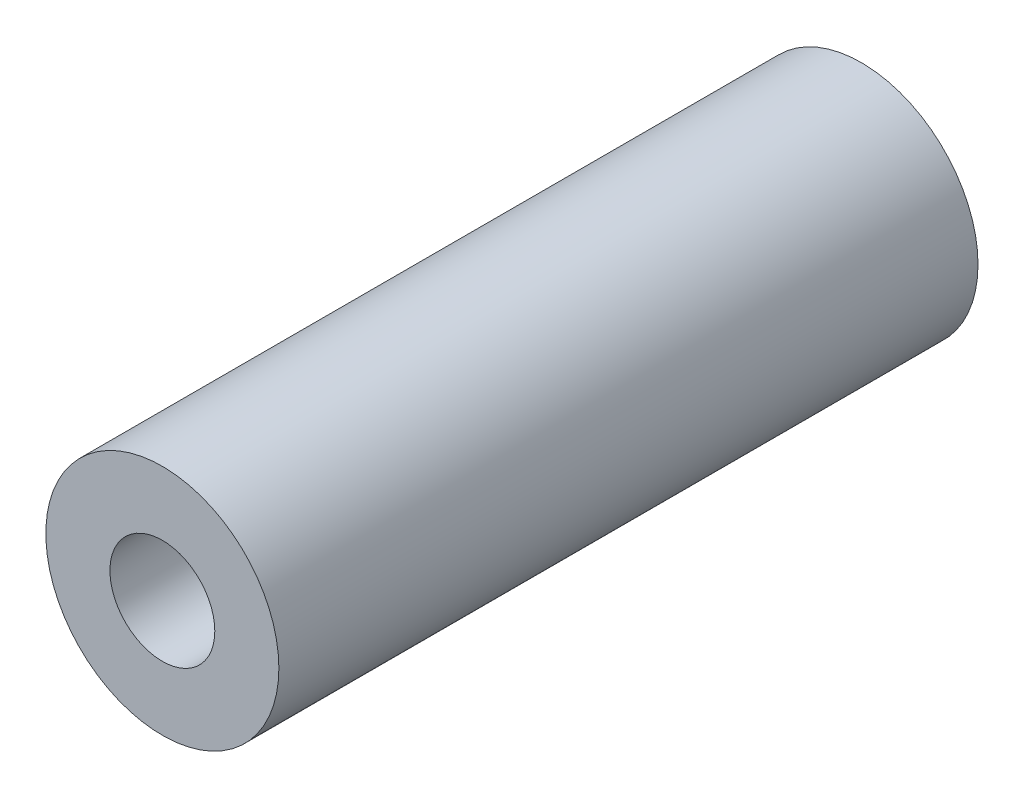
ISO-10303-21;
HEADER;
FILE_DESCRIPTION(('STEP AP214'),'2;1');
FILE_NAME('part.step','',(''),(''),'','','');
FILE_SCHEMA(('AUTOMOTIVE_DESIGN { 1 0 10303 214 1 1 1 1 }'));
ENDSEC;
DATA;
#1=APPLICATION_CONTEXT('core data for automotive mechanical design processes');
#2=APPLICATION_PROTOCOL_DEFINITION('international standard','automotive_design',2000,#1);
#3=PRODUCT_CONTEXT('',#1,'mechanical');
#4=PRODUCT('Part','Part','',(#3));
#5=PRODUCT_RELATED_PRODUCT_CATEGORY('part','',(#4));
#6=PRODUCT_DEFINITION_FORMATION('','',#4);
#7=PRODUCT_DEFINITION_CONTEXT('part definition',#1,'design');
#8=PRODUCT_DEFINITION('design','',#6,#7);
#9=PRODUCT_DEFINITION_SHAPE('','',#8);
#10=(LENGTH_UNIT() NAMED_UNIT(*) SI_UNIT(.MILLI.,.METRE.));
#11=(NAMED_UNIT(*) PLANE_ANGLE_UNIT() SI_UNIT($,.RADIAN.));
#12=(NAMED_UNIT(*) SI_UNIT($,.STERADIAN.) SOLID_ANGLE_UNIT());
#13=UNCERTAINTY_MEASURE_WITH_UNIT(LENGTH_MEASURE(1.E-05),#10,'distance_accuracy_value','');
#14=(GEOMETRIC_REPRESENTATION_CONTEXT(3) GLOBAL_UNCERTAINTY_ASSIGNED_CONTEXT((#13)) GLOBAL_UNIT_ASSIGNED_CONTEXT((#10,
#11,#12)) REPRESENTATION_CONTEXT('',''));
#15=CARTESIAN_POINT('',(0.,0.,0.));
#16=DIRECTION('',(0.,0.,1.));
#17=DIRECTION('',(1.,0.,0.));
#18=AXIS2_PLACEMENT_3D('',#15,#16,#17);
#19=CARTESIAN_POINT('',(0.,0.,30.));
#20=DIRECTION('',(0.,0.,1.));
#21=DIRECTION('',(1.,0.,0.));
#22=AXIS2_PLACEMENT_3D('',#19,#20,#21);
#23=PLANE('',#22);
#24=CARTESIAN_POINT('',(0.,0.,30.));
#25=DIRECTION('',(0.,0.,1.));
#26=DIRECTION('',(1.,0.,0.));
#27=AXIS2_PLACEMENT_3D('',#24,#25,#26);
#28=CIRCLE('',#27,5.);
#29=CARTESIAN_POINT('',(5.,0.,30.));
#30=VERTEX_POINT('',#29);
#31=EDGE_CURVE('E10',#30,#30,#28,.T.);
#32=ORIENTED_EDGE('',*,*,#31,.T.);
#33=EDGE_LOOP('',(#32));
#34=FACE_BOUND('',#33,.T.);
#35=CARTESIAN_POINT('',(0.,0.,30.));
#36=DIRECTION('',(0.,0.,1.));
#37=DIRECTION('',(1.,0.,0.));
#38=AXIS2_PLACEMENT_3D('',#35,#36,#37);
#39=CIRCLE('',#38,2.25);
#40=CARTESIAN_POINT('',(2.25,0.,30.));
#41=VERTEX_POINT('',#40);
#42=EDGE_CURVE('E43',#41,#41,#39,.T.);
#43=ORIENTED_EDGE('',*,*,#42,.F.);
#44=EDGE_LOOP('',(#43));
#45=FACE_BOUND('',#44,.T.);
#46=ADVANCED_FACE('F32',(#34,#45),#23,.T.);
#47=CARTESIAN_POINT('',(0.,0.,0.));
#48=DIRECTION('',(0.,0.,1.));
#49=DIRECTION('',(1.,0.,0.));
#50=AXIS2_PLACEMENT_3D('',#47,#48,#49);
#51=PLANE('',#50);
#52=CARTESIAN_POINT('',(0.,0.,0.));
#53=DIRECTION('',(0.,0.,1.));
#54=DIRECTION('',(1.,0.,0.));
#55=AXIS2_PLACEMENT_3D('',#52,#53,#54);
#56=CIRCLE('',#55,5.);
#57=CARTESIAN_POINT('',(5.,0.,0.));
#58=VERTEX_POINT('',#57);
#59=EDGE_CURVE('E36',#58,#58,#56,.T.);
#60=ORIENTED_EDGE('',*,*,#59,.F.);
#61=EDGE_LOOP('',(#60));
#62=FACE_BOUND('',#61,.T.);
#63=CARTESIAN_POINT('',(0.,0.,0.));
#64=DIRECTION('',(0.,0.,1.));
#65=DIRECTION('',(1.,0.,0.));
#66=AXIS2_PLACEMENT_3D('',#63,#64,#65);
#67=CIRCLE('',#66,2.25);
#68=CARTESIAN_POINT('',(2.25,0.,0.));
#69=VERTEX_POINT('',#68);
#70=EDGE_CURVE('E45',#69,#69,#67,.T.);
#71=ORIENTED_EDGE('',*,*,#70,.T.);
#72=EDGE_LOOP('',(#71));
#73=FACE_BOUND('',#72,.T.);
#74=ADVANCED_FACE('F55',(#62,#73),#51,.F.);
#75=CARTESIAN_POINT('',(0.,0.,30.));
#76=DIRECTION('',(0.,0.,-1.));
#77=DIRECTION('',(-1.,0.,0.));
#78=AXIS2_PLACEMENT_3D('',#75,#76,#77);
#79=CYLINDRICAL_SURFACE('',#78,5.);
#80=ORIENTED_EDGE('',*,*,#31,.F.);
#81=EDGE_LOOP('',(#80));
#82=FACE_BOUND('',#81,.T.);
#83=ORIENTED_EDGE('',*,*,#59,.T.);
#84=EDGE_LOOP('',(#83));
#85=FACE_BOUND('',#84,.T.);
#86=ADVANCED_FACE('F34',(#82,#85),#79,.T.);
#87=CARTESIAN_POINT('',(0.,0.,30.));
#88=DIRECTION('',(0.,0.,-1.));
#89=DIRECTION('',(-1.,0.,0.));
#90=AXIS2_PLACEMENT_3D('',#87,#88,#89);
#91=CYLINDRICAL_SURFACE('',#90,2.25);
#92=ORIENTED_EDGE('',*,*,#42,.T.);
#93=EDGE_LOOP('',(#92));
#94=FACE_BOUND('',#93,.T.);
#95=ORIENTED_EDGE('',*,*,#70,.F.);
#96=EDGE_LOOP('',(#95));
#97=FACE_BOUND('',#96,.T.);
#98=ADVANCED_FACE('F51',(#94,#97),#91,.F.);
#99=CLOSED_SHELL('',(#46,#74,#86,#98));
#100=MANIFOLD_SOLID_BREP('B2',#99);
#101=ADVANCED_BREP_SHAPE_REPRESENTATION('',(#18,#100),#14);
#102=SHAPE_DEFINITION_REPRESENTATION(#9,#101);
ENDSEC;
END-ISO-10303-21;
